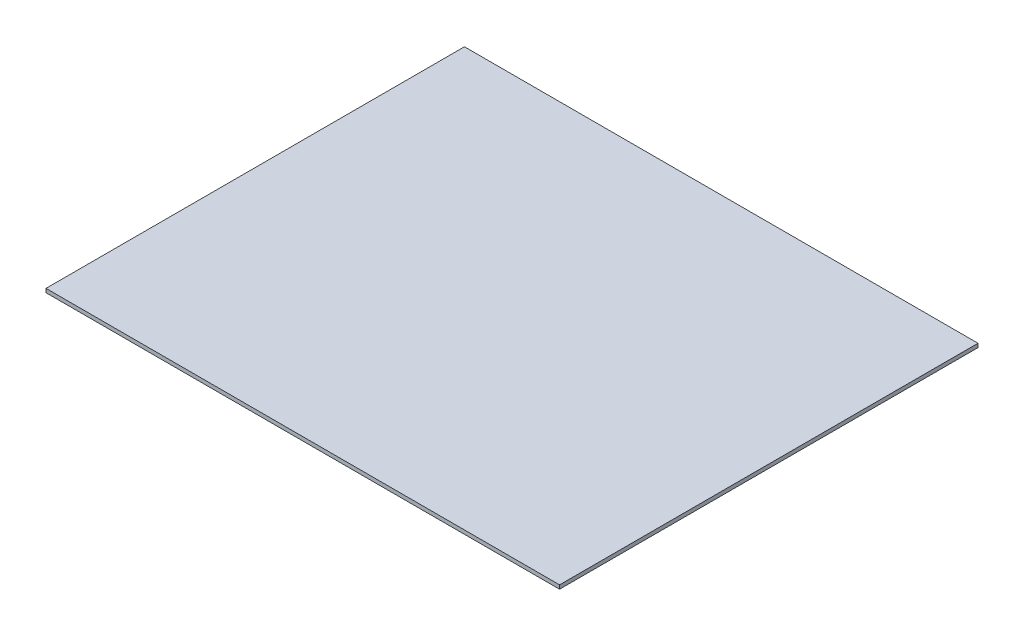
ISO-10303-21;
HEADER;
FILE_DESCRIPTION(('STEP AP214'),'2;1');
FILE_NAME('part.step','',(''),(''),'','','');
FILE_SCHEMA(('AUTOMOTIVE_DESIGN { 1 0 10303 214 1 1 1 1 }'));
ENDSEC;
DATA;
#1=APPLICATION_CONTEXT('core data for automotive mechanical design processes');
#2=APPLICATION_PROTOCOL_DEFINITION('international standard','automotive_design',2000,#1);
#3=PRODUCT_CONTEXT('',#1,'mechanical');
#4=PRODUCT('Part','Part','',(#3));
#5=PRODUCT_RELATED_PRODUCT_CATEGORY('part','',(#4));
#6=PRODUCT_DEFINITION_FORMATION('','',#4);
#7=PRODUCT_DEFINITION_CONTEXT('part definition',#1,'design');
#8=PRODUCT_DEFINITION('design','',#6,#7);
#9=PRODUCT_DEFINITION_SHAPE('','',#8);
#10=(LENGTH_UNIT() NAMED_UNIT(*) SI_UNIT(.MILLI.,.METRE.));
#11=(NAMED_UNIT(*) PLANE_ANGLE_UNIT() SI_UNIT($,.RADIAN.));
#12=(NAMED_UNIT(*) SI_UNIT($,.STERADIAN.) SOLID_ANGLE_UNIT());
#13=UNCERTAINTY_MEASURE_WITH_UNIT(LENGTH_MEASURE(1.E-05),#10,'distance_accuracy_value','');
#14=(GEOMETRIC_REPRESENTATION_CONTEXT(3) GLOBAL_UNCERTAINTY_ASSIGNED_CONTEXT((#13)) GLOBAL_UNIT_ASSIGNED_CONTEXT((#10,
#11,#12)) REPRESENTATION_CONTEXT('',''));
#15=CARTESIAN_POINT('',(0.,0.,0.));
#16=DIRECTION('',(0.,0.,1.));
#17=DIRECTION('',(1.,0.,0.));
#18=AXIS2_PLACEMENT_3D('',#15,#16,#17);
#19=CARTESIAN_POINT('',(-1350.,20.,1100.));
#20=DIRECTION('',(1.,0.,0.));
#21=DIRECTION('',(0.,0.,-1.));
#22=AXIS2_PLACEMENT_3D('',#19,#20,#21);
#23=PLANE('',#22);
#24=DIRECTION('',(0.,0.,1.));
#25=VECTOR('',#24,1.);
#26=CARTESIAN_POINT('',(-1350.,0.,1100.));
#27=LINE('',#26,#25);
#28=CARTESIAN_POINT('',(-1350.,0.,-1100.));
#29=VERTEX_POINT('',#28);
#30=CARTESIAN_POINT('',(-1350.,0.,1100.));
#31=VERTEX_POINT('',#30);
#32=EDGE_CURVE('E96',#29,#31,#27,.T.);
#33=ORIENTED_EDGE('',*,*,#32,.T.);
#34=DIRECTION('',(0.,-1.,0.));
#35=VECTOR('',#34,1.);
#36=CARTESIAN_POINT('',(-1350.,20.,1100.));
#37=LINE('',#36,#35);
#38=CARTESIAN_POINT('',(-1350.,20.,1100.));
#39=VERTEX_POINT('',#38);
#40=EDGE_CURVE('E11',#39,#31,#37,.T.);
#41=ORIENTED_EDGE('',*,*,#40,.F.);
#42=DIRECTION('',(0.,0.,1.));
#43=VECTOR('',#42,1.);
#44=CARTESIAN_POINT('',(-1350.,20.,1100.));
#45=LINE('',#44,#43);
#46=CARTESIAN_POINT('',(-1350.,20.,-1100.));
#47=VERTEX_POINT('',#46);
#48=EDGE_CURVE('E84',#47,#39,#45,.T.);
#49=ORIENTED_EDGE('',*,*,#48,.F.);
#50=DIRECTION('',(0.,-1.,0.));
#51=VECTOR('',#50,1.);
#52=CARTESIAN_POINT('',(-1350.,20.,-1100.));
#53=LINE('',#52,#51);
#54=EDGE_CURVE('E92',#47,#29,#53,.T.);
#55=ORIENTED_EDGE('',*,*,#54,.T.);
#56=EDGE_LOOP('',(#33,#41,#49,#55));
#57=FACE_BOUND('',#56,.T.);
#58=ADVANCED_FACE('F33',(#57),#23,.F.);
#59=CARTESIAN_POINT('',(1350.,20.,1100.));
#60=DIRECTION('',(0.,0.,-1.));
#61=DIRECTION('',(-1.,0.,0.));
#62=AXIS2_PLACEMENT_3D('',#59,#60,#61);
#63=PLANE('',#62);
#64=DIRECTION('',(1.,0.,0.));
#65=VECTOR('',#64,1.);
#66=CARTESIAN_POINT('',(1350.,0.,1100.));
#67=LINE('',#66,#65);
#68=CARTESIAN_POINT('',(1350.,0.,1100.));
#69=VERTEX_POINT('',#68);
#70=EDGE_CURVE('E88',#31,#69,#67,.T.);
#71=ORIENTED_EDGE('',*,*,#70,.T.);
#72=DIRECTION('',(0.,-1.,0.));
#73=VECTOR('',#72,1.);
#74=CARTESIAN_POINT('',(1350.,20.,1100.));
#75=LINE('',#74,#73);
#76=CARTESIAN_POINT('',(1350.,20.,1100.));
#77=VERTEX_POINT('',#76);
#78=EDGE_CURVE('E41',#77,#69,#75,.T.);
#79=ORIENTED_EDGE('',*,*,#78,.F.);
#80=DIRECTION('',(1.,0.,0.));
#81=VECTOR('',#80,1.);
#82=CARTESIAN_POINT('',(1350.,20.,1100.));
#83=LINE('',#82,#81);
#84=EDGE_CURVE('E79',#39,#77,#83,.T.);
#85=ORIENTED_EDGE('',*,*,#84,.F.);
#86=ORIENTED_EDGE('',*,*,#40,.T.);
#87=EDGE_LOOP('',(#71,#79,#85,#86));
#88=FACE_BOUND('',#87,.T.);
#89=ADVANCED_FACE('F87',(#88),#63,.F.);
#90=CARTESIAN_POINT('',(1350.,20.,1100.));
#91=DIRECTION('',(-1.,0.,0.));
#92=DIRECTION('',(0.,0.,1.));
#93=AXIS2_PLACEMENT_3D('',#90,#91,#92);
#94=PLANE('',#93);
#95=DIRECTION('',(0.,0.,-1.));
#96=VECTOR('',#95,1.);
#97=CARTESIAN_POINT('',(1350.,0.,1100.));
#98=LINE('',#97,#96);
#99=CARTESIAN_POINT('',(1350.,0.,-1100.));
#100=VERTEX_POINT('',#99);
#101=EDGE_CURVE('E66',#69,#100,#98,.T.);
#102=ORIENTED_EDGE('',*,*,#101,.T.);
#103=DIRECTION('',(0.,-1.,0.));
#104=VECTOR('',#103,1.);
#105=CARTESIAN_POINT('',(1350.,20.,-1100.));
#106=LINE('',#105,#104);
#107=CARTESIAN_POINT('',(1350.,20.,-1100.));
#108=VERTEX_POINT('',#107);
#109=EDGE_CURVE('E89',#108,#100,#106,.T.);
#110=ORIENTED_EDGE('',*,*,#109,.F.);
#111=DIRECTION('',(0.,0.,-1.));
#112=VECTOR('',#111,1.);
#113=CARTESIAN_POINT('',(1350.,20.,1100.));
#114=LINE('',#113,#112);
#115=EDGE_CURVE('E82',#77,#108,#114,.T.);
#116=ORIENTED_EDGE('',*,*,#115,.F.);
#117=ORIENTED_EDGE('',*,*,#78,.T.);
#118=EDGE_LOOP('',(#102,#110,#116,#117));
#119=FACE_BOUND('',#118,.T.);
#120=ADVANCED_FACE('F90',(#119),#94,.F.);
#121=CARTESIAN_POINT('',(1350.,20.,-1100.));
#122=DIRECTION('',(0.,0.,1.));
#123=DIRECTION('',(1.,0.,0.));
#124=AXIS2_PLACEMENT_3D('',#121,#122,#123);
#125=PLANE('',#124);
#126=DIRECTION('',(-1.,0.,0.));
#127=VECTOR('',#126,1.);
#128=CARTESIAN_POINT('',(1350.,0.,-1100.));
#129=LINE('',#128,#127);
#130=EDGE_CURVE('E72',#100,#29,#129,.T.);
#131=ORIENTED_EDGE('',*,*,#130,.T.);
#132=ORIENTED_EDGE('',*,*,#54,.F.);
#133=DIRECTION('',(-1.,0.,0.));
#134=VECTOR('',#133,1.);
#135=CARTESIAN_POINT('',(1350.,20.,-1100.));
#136=LINE('',#135,#134);
#137=EDGE_CURVE('E49',#108,#47,#136,.T.);
#138=ORIENTED_EDGE('',*,*,#137,.F.);
#139=ORIENTED_EDGE('',*,*,#109,.T.);
#140=EDGE_LOOP('',(#131,#132,#138,#139));
#141=FACE_BOUND('',#140,.T.);
#142=ADVANCED_FACE('F103',(#141),#125,.F.);
#143=CARTESIAN_POINT('',(0.,20.,0.));
#144=DIRECTION('',(0.,1.,0.));
#145=DIRECTION('',(0.,0.,1.));
#146=AXIS2_PLACEMENT_3D('',#143,#144,#145);
#147=PLANE('',#146);
#148=ORIENTED_EDGE('',*,*,#48,.T.);
#149=ORIENTED_EDGE('',*,*,#84,.T.);
#150=ORIENTED_EDGE('',*,*,#115,.T.);
#151=ORIENTED_EDGE('',*,*,#137,.T.);
#152=EDGE_LOOP('',(#148,#149,#150,#151));
#153=FACE_BOUND('',#152,.T.);
#154=ADVANCED_FACE('F80',(#153),#147,.T.);
#155=CARTESIAN_POINT('',(0.,0.,0.));
#156=DIRECTION('',(0.,1.,0.));
#157=DIRECTION('',(0.,0.,1.));
#158=AXIS2_PLACEMENT_3D('',#155,#156,#157);
#159=PLANE('',#158);
#160=ORIENTED_EDGE('',*,*,#32,.F.);
#161=ORIENTED_EDGE('',*,*,#130,.F.);
#162=ORIENTED_EDGE('',*,*,#101,.F.);
#163=ORIENTED_EDGE('',*,*,#70,.F.);
#164=EDGE_LOOP('',(#160,#161,#162,#163));
#165=FACE_BOUND('',#164,.T.);
#166=ADVANCED_FACE('F106',(#165),#159,.F.);
#167=CLOSED_SHELL('',(#58,#89,#120,#142,#154,#166));
#168=MANIFOLD_SOLID_BREP('B2',#167);
#169=ADVANCED_BREP_SHAPE_REPRESENTATION('',(#18,#168),#14);
#170=SHAPE_DEFINITION_REPRESENTATION(#9,#169);
ENDSEC;
END-ISO-10303-21;
